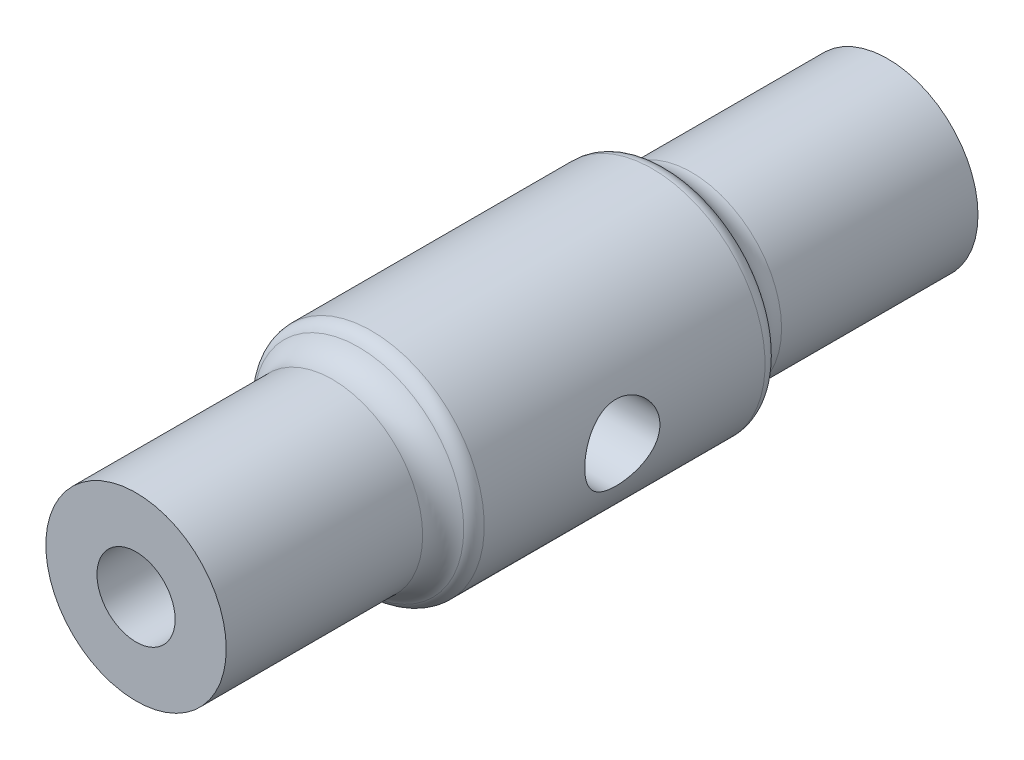
ISO-10303-21;
HEADER;
FILE_DESCRIPTION(('STEP AP214'),'2;1');
FILE_NAME('part.step','',(''),(''),'','','');
FILE_SCHEMA(('AUTOMOTIVE_DESIGN { 1 0 10303 214 1 1 1 1 }'));
ENDSEC;
DATA;
#1=APPLICATION_CONTEXT('core data for automotive mechanical design processes');
#2=APPLICATION_PROTOCOL_DEFINITION('international standard','automotive_design',2000,#1);
#3=PRODUCT_CONTEXT('',#1,'mechanical');
#4=PRODUCT('Part','Part','',(#3));
#5=PRODUCT_RELATED_PRODUCT_CATEGORY('part','',(#4));
#6=PRODUCT_DEFINITION_FORMATION('','',#4);
#7=PRODUCT_DEFINITION_CONTEXT('part definition',#1,'design');
#8=PRODUCT_DEFINITION('design','',#6,#7);
#9=PRODUCT_DEFINITION_SHAPE('','',#8);
#10=(LENGTH_UNIT() NAMED_UNIT(*) SI_UNIT(.MILLI.,.METRE.));
#11=(NAMED_UNIT(*) PLANE_ANGLE_UNIT() SI_UNIT($,.RADIAN.));
#12=(NAMED_UNIT(*) SI_UNIT($,.STERADIAN.) SOLID_ANGLE_UNIT());
#13=UNCERTAINTY_MEASURE_WITH_UNIT(LENGTH_MEASURE(1.E-05),#10,'distance_accuracy_value','');
#14=(GEOMETRIC_REPRESENTATION_CONTEXT(3) GLOBAL_UNCERTAINTY_ASSIGNED_CONTEXT((#13)) GLOBAL_UNIT_ASSIGNED_CONTEXT((#10,
#11,#12)) REPRESENTATION_CONTEXT('',''));
#15=CARTESIAN_POINT('',(0.,0.,0.));
#16=DIRECTION('',(0.,0.,1.));
#17=DIRECTION('',(1.,0.,0.));
#18=AXIS2_PLACEMENT_3D('',#15,#16,#17);
#19=CARTESIAN_POINT('',(-11.,0.,17.6554843869567));
#20=DIRECTION('',(1.,0.,0.));
#21=DIRECTION('',(0.,0.,-1.));
#22=AXIS2_PLACEMENT_3D('',#19,#20,#21);
#23=CYLINDRICAL_SURFACE('',#22,2.5);
#24=CARTESIAN_POINT('',(7.5,0.,15.1554843869567));
#25=CARTESIAN_POINT('',(7.5000003825236,-0.136408407216808,15.1554837526276));
#26=CARTESIAN_POINT('',(7.49624423768862,-0.272812986346375,15.1666850522748));
#27=CARTESIAN_POINT('',(7.48163025508202,-0.541604402182431,15.2110571589998));
#28=CARTESIAN_POINT('',(7.47077168005381,-0.673990820297044,15.244230246829));
#29=CARTESIAN_POINT('',(7.44313269766107,-0.93083197375444,15.3312824954169));
#30=CARTESIAN_POINT('',(7.42636219327133,-1.05529956471509,15.3851270431049));
#31=CARTESIAN_POINT('',(7.38861114293354,-1.29343734201331,15.5118373190526));
#32=CARTESIAN_POINT('',(7.36762976669445,-1.40710539239676,15.5847067994632));
#33=CARTESIAN_POINT('',(7.32285236107513,-1.62435418755567,15.7500488991036));
#34=CARTESIAN_POINT('',(7.29898891159462,-1.72750925074577,15.843062472608));
#35=CARTESIAN_POINT('',(7.25150786957803,-1.91708173175521,16.0449022737232));
#36=CARTESIAN_POINT('',(7.22789033226373,-2.00349546372366,16.153731974278));
#37=CARTESIAN_POINT('',(7.18283331193184,-2.15956235556965,16.3879471749479));
#38=CARTESIAN_POINT('',(7.1614759818922,-2.22866214555258,16.5137187362871));
#39=CARTESIAN_POINT('',(7.12438263546503,-2.3445471846943,16.7759246231031));
#40=CARTESIAN_POINT('',(7.10864490401864,-2.39133924346691,16.9123556798636));
#41=CARTESIAN_POINT('',(7.08528258173443,-2.45968365377291,17.1871674406985));
#42=CARTESIAN_POINT('',(7.07740239424028,-2.48203362067942,17.3253274081794));
#43=CARTESIAN_POINT('',(7.06989141573769,-2.50335280833619,17.6036437723464));
#44=CARTESIAN_POINT('',(7.07025807556825,-2.5023292540118,17.7437995387297));
#45=CARTESIAN_POINT('',(7.0789753752045,-2.47754975925855,18.0153259630668));
#46=CARTESIAN_POINT('',(7.08696039668832,-2.45483478291749,18.1468053942543));
#47=CARTESIAN_POINT('',(7.10941644311377,-2.38901540712354,18.4039679359738));
#48=CARTESIAN_POINT('',(7.12388824460269,-2.34590856647968,18.5296503505444));
#49=CARTESIAN_POINT('',(7.15794777828122,-2.23984764515053,18.7740162609354));
#50=CARTESIAN_POINT('',(7.17761414482793,-2.17658512176816,18.8925544506306));
#51=CARTESIAN_POINT('',(7.21981396439316,-2.03222276575785,19.1176616576561));
#52=CARTESIAN_POINT('',(7.24234824476159,-1.95111778091001,19.2242272042902));
#53=CARTESIAN_POINT('',(7.28918322919352,-1.76837333170559,19.4282133823587));
#54=CARTESIAN_POINT('',(7.31351473387107,-1.66588287519078,19.5248661232294));
#55=CARTESIAN_POINT('',(7.36017345967592,-1.44584892492516,19.6998125536152));
#56=CARTESIAN_POINT('',(7.38250048845168,-1.32830398915204,19.778104482368));
#57=CARTESIAN_POINT('',(7.42292769844484,-1.07986903261567,19.9147251375444));
#58=CARTESIAN_POINT('',(7.44098375020098,-0.948858191040842,19.9728481153086));
#59=CARTESIAN_POINT('',(7.47051417861087,-0.67817270841127,20.065992321846));
#60=CARTESIAN_POINT('',(7.48199084137198,-0.538501095387385,20.1010215755153));
#61=CARTESIAN_POINT('',(7.49669067678601,-0.260959573823261,20.1456235520126));
#62=CARTESIAN_POINT('',(7.5002500458432,-0.123273999662117,20.1562339098886));
#63=CARTESIAN_POINT('',(7.49972256737068,0.151937674900592,20.1546527029606));
#64=CARTESIAN_POINT('',(7.49563701048406,0.289463798299125,20.1424649870071));
#65=CARTESIAN_POINT('',(7.48050061792761,0.556299665760638,20.0964546176168));
#66=CARTESIAN_POINT('',(7.46965496777981,0.685732017087108,20.063268871833));
#67=CARTESIAN_POINT('',(7.44229617075175,0.937139896448933,19.9770007757899));
#68=CARTESIAN_POINT('',(7.42578230116688,1.05911447127152,19.9239158882873));
#69=CARTESIAN_POINT('',(7.38822328218224,1.29572074098318,19.7978083073548));
#70=CARTESIAN_POINT('',(7.36707036889465,1.41007489804287,19.7242979037488));
#71=CARTESIAN_POINT('',(7.32263134790656,1.62516207533897,19.559999011923));
#72=CARTESIAN_POINT('',(7.29934458984569,1.72589091948894,19.4692052468773));
#73=CARTESIAN_POINT('',(7.25192119951112,1.91563126951575,19.2680375094403));
#74=CARTESIAN_POINT('',(7.2277940271857,2.00390242311443,19.1569613196396));
#75=CARTESIAN_POINT('',(7.18249933236772,2.16064380580894,18.9210554674295));
#76=CARTESIAN_POINT('',(7.16133183455006,2.22911386982753,18.7962256903716));
#77=CARTESIAN_POINT('',(7.12455979478459,2.3439923260409,18.536301848732));
#78=CARTESIAN_POINT('',(7.10894401982447,2.39044533041255,18.4012291890348));
#79=CARTESIAN_POINT('',(7.08527080766124,2.45973666689839,18.1245377618464));
#80=CARTESIAN_POINT('',(7.07720996559098,2.48258563738485,17.9829219734459));
#81=CARTESIAN_POINT('',(7.06994647185443,2.50319070619336,17.7049916468545));
#82=CARTESIAN_POINT('',(7.07031000643538,2.502175643271,17.5687785362397));
#83=CARTESIAN_POINT('',(7.07878174559668,2.47810573362173,17.2985716996516));
#84=CARTESIAN_POINT('',(7.08688948923404,2.45505219864646,17.164577842069));
#85=CARTESIAN_POINT('',(7.10961310762229,2.38842953282336,16.9051452294506));
#86=CARTESIAN_POINT('',(7.12410245056194,2.34525836503879,16.7795923244455));
#87=CARTESIAN_POINT('',(7.15790997046171,2.23994841439937,16.5374158696111));
#88=CARTESIAN_POINT('',(7.17722921908483,2.17780542138451,16.4207943089867));
#89=CARTESIAN_POINT('',(7.21957073065115,2.03315173145857,16.1942752121495));
#90=CARTESIAN_POINT('',(7.24271779105343,1.94987060691145,16.0848931322108));
#91=CARTESIAN_POINT('',(7.28958390708132,1.76660720783912,15.8812598534962));
#92=CARTESIAN_POINT('',(7.31330312280931,1.6666202111287,15.7870129477366));
#93=CARTESIAN_POINT('',(7.3597507631386,1.44810389230172,15.6126233562338));
#94=CARTESIAN_POINT('',(7.38240454503142,1.32900378374932,15.5331735175792));
#95=CARTESIAN_POINT('',(7.4231497793153,1.07839339351656,15.3955083148301));
#96=CARTESIAN_POINT('',(7.44124239769824,0.946886295330873,15.3372875221516));
#97=CARTESIAN_POINT('',(7.47013787671354,0.681234118002441,15.2461803057351));
#98=CARTESIAN_POINT('',(7.48123031056307,0.547469394191022,15.2122782212983));
#99=CARTESIAN_POINT('',(7.49616017660555,0.275801040025617,15.1669336852639));
#100=CARTESIAN_POINT('',(7.49999961329762,0.137898563921866,15.1554850282154));
#101=CARTESIAN_POINT('',(7.5,0.,15.1554843869567));
#102=B_SPLINE_CURVE_WITH_KNOTS('',3,(#24,#25,#26,#27,#28,#29,#30,#31,#32,#33,#34,#35,#36,#37,
#38,#39,#40,#41,#42,#43,#44,#45,#46,#47,#48,#49,#50,#51,#52,#53,#54,#55,#56,#57,#58,#59,#60,#61,
#62,#63,#64,#65,#66,#67,#68,#69,#70,#71,#72,#73,#74,#75,#76,#77,#78,#79,#80,#81,#82,#83,#84,#85,
#86,#87,#88,#89,#90,#91,#92,#93,#94,#95,#96,#97,#98,#99,#100,#101),.UNSPECIFIED.,.T.,.F.,(4,2,2,
2,2,2,2,2,2,2,2,2,2,2,2,2,2,2,2,2,2,2,2,2,2,2,2,2,2,2,2,2,2,2,2,2,2,2,4),(0.,0.408717765065027,
0.817477963168802,1.22555668217568,1.63371594449775,2.0546171070689,2.47561083218826,
2.90870962058676,3.34167611732083,3.760048143546,4.17829084968713,4.57742066378201,
4.97659827138705,5.38220427887827,5.78792756395518,6.21483264528417,6.64177864916546,
7.07296014125894,7.50399172193021,7.91633957937924,8.32861782910441,8.72895394945534,
9.1293411321026,9.54025999609341,9.95130452054728,10.3810255720188,10.8107502058749,
11.2396003456693,11.668257117646,12.0748916516065,12.4815019837844,12.8803896770104,
13.2793659543994,13.6957516672951,14.1122552780945,14.5449915208775,14.9776170288114,
15.3909139593453,15.8040966509535),.UNSPECIFIED.);
#103=CARTESIAN_POINT('',(7.5,0.,15.1554843869567));
#104=VERTEX_POINT('',#103);
#105=EDGE_CURVE('E132',#104,#104,#102,.T.);
#106=ORIENTED_EDGE('',*,*,#105,.F.);
#107=EDGE_LOOP('',(#106));
#108=FACE_BOUND('',#107,.T.);
#109=CARTESIAN_POINT('',(2.99999999999999,0.,17.6554843869567));
#110=DIRECTION('',(1.,0.,0.));
#111=DIRECTION('',(0.,0.,-1.));
#112=AXIS2_PLACEMENT_3D('',#109,#110,#111);
#113=CIRCLE('',#112,2.5);
#114=CARTESIAN_POINT('',(2.99999999999999,0.,15.1554843869567));
#115=VERTEX_POINT('',#114);
#116=EDGE_CURVE('E209',#115,#115,#113,.F.);
#117=ORIENTED_EDGE('',*,*,#116,.T.);
#118=EDGE_LOOP('',(#117));
#119=FACE_BOUND('',#118,.T.);
#120=ADVANCED_FACE('F40',(#108,#119),#23,.F.);
#121=CARTESIAN_POINT('',(0.,0.,7.49999999999999));
#122=DIRECTION('',(0.,0.,-1.));
#123=DIRECTION('',(-1.,0.,0.));
#124=AXIS2_PLACEMENT_3D('',#121,#122,#123);
#125=CYLINDRICAL_SURFACE('',#124,6.);
#126=CARTESIAN_POINT('',(0.,0.,5.56350832689628));
#127=DIRECTION('',(0.,0.,1.));
#128=DIRECTION('',(1.,0.,0.));
#129=AXIS2_PLACEMENT_3D('',#126,#127,#128);
#130=CIRCLE('',#129,6.);
#131=CARTESIAN_POINT('',(6.,0.,5.56350832689628));
#132=VERTEX_POINT('',#131);
#133=EDGE_CURVE('E255',#132,#132,#130,.F.);
#134=ORIENTED_EDGE('',*,*,#133,.T.);
#135=EDGE_LOOP('',(#134));
#136=FACE_BOUND('',#135,.T.);
#137=CARTESIAN_POINT('',(0.,0.,-7.49999999999999));
#138=DIRECTION('',(0.,0.,1.));
#139=DIRECTION('',(1.,0.,0.));
#140=AXIS2_PLACEMENT_3D('',#137,#138,#139);
#141=CIRCLE('',#140,6.);
#142=CARTESIAN_POINT('',(6.,0.,-7.49999999999999));
#143=VERTEX_POINT('',#142);
#144=EDGE_CURVE('E146',#143,#143,#141,.T.);
#145=ORIENTED_EDGE('',*,*,#144,.T.);
#146=EDGE_LOOP('',(#145));
#147=FACE_BOUND('',#146,.T.);
#148=ADVANCED_FACE('F198',(#136,#147),#125,.T.);
#149=CARTESIAN_POINT('',(0.,0.,-7.49999999999999));
#150=DIRECTION('',(0.,0.,1.));
#151=DIRECTION('',(1.,0.,0.));
#152=AXIS2_PLACEMENT_3D('',#149,#150,#151);
#153=PLANE('',#152);
#154=CARTESIAN_POINT('',(0.,0.,-7.49999999999999));
#155=DIRECTION('',(0.,0.,-1.));
#156=DIRECTION('',(-1.,0.,0.));
#157=AXIS2_PLACEMENT_3D('',#154,#155,#156);
#158=CIRCLE('',#157,3.1);
#159=CARTESIAN_POINT('',(-3.1,0.,-7.49999999999999));
#160=VERTEX_POINT('',#159);
#161=EDGE_CURVE('E138',#160,#160,#158,.T.);
#162=ORIENTED_EDGE('',*,*,#161,.F.);
#163=EDGE_LOOP('',(#162));
#164=FACE_BOUND('',#163,.T.);
#165=ORIENTED_EDGE('',*,*,#144,.F.);
#166=EDGE_LOOP('',(#165));
#167=FACE_BOUND('',#166,.T.);
#168=ADVANCED_FACE('F193',(#164,#167),#153,.F.);
#169=CARTESIAN_POINT('',(0.,0.,27.5));
#170=DIRECTION('',(0.,0.,-1.));
#171=DIRECTION('',(-1.,0.,0.));
#172=AXIS2_PLACEMENT_3D('',#169,#170,#171);
#173=CYLINDRICAL_SURFACE('',#172,7.5);
#174=CARTESIAN_POINT('',(0.,0.,26.8384154617504));
#175=DIRECTION('',(0.,0.,-1.));
#176=DIRECTION('',(-1.,0.,0.));
#177=AXIS2_PLACEMENT_3D('',#174,#175,#176);
#178=CIRCLE('',#177,7.5);
#179=CARTESIAN_POINT('',(-7.5,0.,26.8384154617504));
#180=VERTEX_POINT('',#179);
#181=EDGE_CURVE('E49',#180,#180,#178,.T.);
#182=ORIENTED_EDGE('',*,*,#181,.T.);
#183=EDGE_LOOP('',(#182));
#184=FACE_BOUND('',#183,.T.);
#185=CARTESIAN_POINT('',(0.,0.,8.1615845382496));
#186=DIRECTION('',(0.,0.,-1.));
#187=DIRECTION('',(-1.,0.,0.));
#188=AXIS2_PLACEMENT_3D('',#185,#186,#187);
#189=CIRCLE('',#188,7.5);
#190=CARTESIAN_POINT('',(-7.5,0.,8.1615845382496));
#191=VERTEX_POINT('',#190);
#192=EDGE_CURVE('E265',#191,#191,#189,.F.);
#193=ORIENTED_EDGE('',*,*,#192,.T.);
#194=EDGE_LOOP('',(#193));
#195=FACE_BOUND('',#194,.T.);
#196=DIRECTION('',(0.,0.,-1.));
#197=VECTOR('',#196,1.);
#198=CARTESIAN_POINT('',(2.99999999999999,-6.87386354243376,27.5));
#199=LINE('',#198,#197);
#200=CARTESIAN_POINT('',(2.99999999999999,-6.87386354243376,23.5));
#201=VERTEX_POINT('',#200);
#202=CARTESIAN_POINT('',(2.99999999999999,-6.87386354243377,11.5));
#203=VERTEX_POINT('',#202);
#204=EDGE_CURVE('E128',#201,#203,#199,.T.);
#205=ORIENTED_EDGE('',*,*,#204,.T.);
#206=CARTESIAN_POINT('',(2.99999999999998,-6.87386354243377,11.5));
#207=CARTESIAN_POINT('',(3.00001197054519,-6.87384696705573,11.4192912212461));
#208=CARTESIAN_POINT('',(2.99674337049035,-6.87528459115985,11.3385915016635));
#209=CARTESIAN_POINT('',(2.98373858960168,-6.88094438126316,11.1778430526179));
#210=CARTESIAN_POINT('',(2.97400487203187,-6.88516548672819,11.0977940869659));
#211=CARTESIAN_POINT('',(2.94821405514552,-6.8962467438096,10.9392297676618));
#212=CARTESIAN_POINT('',(2.93218195230648,-6.903096460763,10.860709623934));
#213=CARTESIAN_POINT('',(2.89397445285989,-6.91920079945024,10.7054488424283));
#214=CARTESIAN_POINT('',(2.87179868125636,-6.92845556798099,10.6287083135841));
#215=CARTESIAN_POINT('',(2.79640457690277,-6.95938936872632,10.4020962241273));
#216=CARTESIAN_POINT('',(2.73426734189982,-6.98426173736141,10.2555186539667));
#217=CARTESIAN_POINT('',(2.5882228738829,-7.03968556148076,9.97480662987474));
#218=CARTESIAN_POINT('',(2.50429494505492,-7.0702424079603,9.84068417055253));
#219=CARTESIAN_POINT('',(2.31197753605169,-7.13551499103152,9.58110640499389));
#220=CARTESIAN_POINT('',(2.20255370988668,-7.17036368453198,9.45644917463968));
#221=CARTESIAN_POINT('',(1.96454469264737,-7.23919185823061,9.22668959166387));
#222=CARTESIAN_POINT('',(1.83595557751111,-7.27317115874872,9.12159125362648));
#223=CARTESIAN_POINT('',(1.55700886211799,-7.33805125658822,8.92989040878438));
#224=CARTESIAN_POINT('',(1.4059918995136,-7.36877736814151,8.84418278640305));
#225=CARTESIAN_POINT('',(1.09023621493285,-7.42205916188651,8.69973389067122));
#226=CARTESIAN_POINT('',(0.925503253773989,-7.44461825320555,8.64098136281726));
#227=CARTESIAN_POINT('',(0.595451161720256,-7.47807471976652,8.55498819908586));
#228=CARTESIAN_POINT('',(0.430546580969978,-7.48948383807038,8.52635957747868));
#229=CARTESIAN_POINT('',(0.0979026464990811,-7.50120465316475,8.49695727624577));
#230=CARTESIAN_POINT('',(-0.0698356818926868,-7.50152028134854,8.49617372867518));
#231=CARTESIAN_POINT('',(-0.39335006720335,-7.4913294001575,8.52172427222666));
#232=CARTESIAN_POINT('',(-0.549268814165814,-7.4814297818847,8.54653761902634));
#233=CARTESIAN_POINT('',(-0.854512169345185,-7.45273905851901,8.61999009156219));
#234=CARTESIAN_POINT('',(-1.00383640384673,-7.43394745021635,8.66863056571331));
#235=CARTESIAN_POINT('',(-1.29434634795235,-7.38895245180781,8.78895462997904));
#236=CARTESIAN_POINT('',(-1.43537542490131,-7.36264159438053,8.86097455766593));
#237=CARTESIAN_POINT('',(-1.70371105589306,-7.3052190570873,9.02569618619784));
#238=CARTESIAN_POINT('',(-1.83101277242677,-7.27410569415328,9.11840514273941));
#239=CARTESIAN_POINT('',(-2.07714567767013,-7.20782663388155,9.32896904281453));
#240=CARTESIAN_POINT('',(-2.19487381816114,-7.1725289948941,9.44807437428684));
#241=CARTESIAN_POINT('',(-2.40914662637397,-7.10342966887715,9.704459475319));
#242=CARTESIAN_POINT('',(-2.50568164332937,-7.06962866894582,9.8417474793345));
#243=CARTESIAN_POINT('',(-2.67741358498184,-7.00643374962441,10.1357464775125));
#244=CARTESIAN_POINT('',(-2.75191695124999,-6.97719454236199,10.2929025324399));
#245=CARTESIAN_POINT('',(-2.84263490078037,-6.9404952078888,10.5371931214669));
#246=CARTESIAN_POINT('',(-2.86936403010708,-6.9294571842925,10.6200279008907));
#247=CARTESIAN_POINT('',(-2.91558286122441,-6.91013780495909,10.7879955053447));
#248=CARTESIAN_POINT('',(-2.93507580880163,-6.90185521344748,10.8731272816319));
#249=CARTESIAN_POINT('',(-2.9671465034321,-6.88813294674513,11.0480858189905));
#250=CARTESIAN_POINT('',(-2.97945146739824,-6.88280576081462,11.1379715123992));
#251=CARTESIAN_POINT('',(-2.99588533788013,-6.87565891169681,11.3185673309109));
#252=CARTESIAN_POINT('',(-3.00001928240829,-6.87383708722422,11.4092769133423));
#253=CARTESIAN_POINT('',(-3.,-6.87386354243376,11.5));
#254=B_SPLINE_CURVE_WITH_KNOTS('',3,(#206,#207,#208,#209,#210,#211,#212,#213,#214,#215,#216,
#217,#218,#219,#220,#221,#222,#223,#224,#225,#226,#227,#228,#229,#230,#231,#232,#233,#234,#235,
#236,#237,#238,#239,#240,#241,#242,#243,#244,#245,#246,#247,#248,#249,#250,#251,#252,#253),
.UNSPECIFIED.,.F.,.F.,(4,2,2,2,2,2,2,2,2,2,2,2,2,2,2,2,2,2,2,2,2,2,2,4),(0.,0.242032279648233,
0.483972395824809,0.724961866877818,0.965966050638455,1.44702450260864,1.92854152413938,
2.43477071993246,2.94110370808785,3.46744288388644,3.99356209795982,4.49420814756403,
4.99467677271981,5.467033728893,5.93941741958479,6.41892265391317,6.89859631699525,
7.4097281201193,7.92109219805104,8.44716362321897,8.71006957989812,8.97285746730815,
9.24506062179347,9.51709589132969),.UNSPECIFIED.);
#255=CARTESIAN_POINT('',(-2.99999999999999,-6.87386354243377,11.5));
#256=VERTEX_POINT('',#255);
#257=EDGE_CURVE('E64',#203,#256,#254,.T.);
#258=ORIENTED_EDGE('',*,*,#257,.T.);
#259=DIRECTION('',(0.,0.,-1.));
#260=VECTOR('',#259,1.);
#261=CARTESIAN_POINT('',(-2.99999999999999,-6.87386354243377,27.5));
#262=LINE('',#261,#260);
#263=CARTESIAN_POINT('',(-2.99999999999999,-6.87386354243377,23.5));
#264=VERTEX_POINT('',#263);
#265=EDGE_CURVE('E88',#256,#264,#262,.F.);
#266=ORIENTED_EDGE('',*,*,#265,.T.);
#267=CARTESIAN_POINT('',(-2.99999999999998,-6.87386354243377,23.5));
#268=CARTESIAN_POINT('',(-3.0000119705452,-6.87384696705573,23.5807087787539));
#269=CARTESIAN_POINT('',(-2.99674337049036,-6.87528459115984,23.6614084983365));
#270=CARTESIAN_POINT('',(-2.98373858960168,-6.88094438126316,23.822156947382));
#271=CARTESIAN_POINT('',(-2.97400487203188,-6.88516548672818,23.902205913034));
#272=CARTESIAN_POINT('',(-2.94821405514553,-6.8962467438096,24.0607702323382));
#273=CARTESIAN_POINT('',(-2.93218195230649,-6.90309646076299,24.139290376066));
#274=CARTESIAN_POINT('',(-2.8939744528599,-6.91920079945024,24.2945511575717));
#275=CARTESIAN_POINT('',(-2.87179868125637,-6.92845556798099,24.3712916864159));
#276=CARTESIAN_POINT('',(-2.79640457690278,-6.95938936872632,24.5979037758727));
#277=CARTESIAN_POINT('',(-2.73426734189983,-6.98426173736141,24.7444813460333));
#278=CARTESIAN_POINT('',(-2.58822287388291,-7.03968556148075,25.0251933701252));
#279=CARTESIAN_POINT('',(-2.50429494505493,-7.0702424079603,25.1593158294474));
#280=CARTESIAN_POINT('',(-2.3119775360517,-7.13551499103151,25.4188935950061));
#281=CARTESIAN_POINT('',(-2.20255370988669,-7.17036368453197,25.5435508253603));
#282=CARTESIAN_POINT('',(-1.96454469264738,-7.23919185823061,25.7733104083361));
#283=CARTESIAN_POINT('',(-1.83595557751112,-7.27317115874871,25.8784087463735));
#284=CARTESIAN_POINT('',(-1.557008862118,-7.33805125658822,26.0701095912156));
#285=CARTESIAN_POINT('',(-1.40599189951361,-7.36877736814151,26.1558172135969));
#286=CARTESIAN_POINT('',(-1.09023621493286,-7.42205916188651,26.3002661093288));
#287=CARTESIAN_POINT('',(-0.925503253773998,-7.44461825320555,26.3590186371827));
#288=CARTESIAN_POINT('',(-0.595451161720264,-7.47807471976652,26.4450118009141));
#289=CARTESIAN_POINT('',(-0.430546580969987,-7.48948383807038,26.4736404225213));
#290=CARTESIAN_POINT('',(-0.0979026464990896,-7.50120465316475,26.5030427237542));
#291=CARTESIAN_POINT('',(0.0698356818926786,-7.50152028134854,26.5038262713248));
#292=CARTESIAN_POINT('',(0.393350067203341,-7.4913294001575,26.4782757277733));
#293=CARTESIAN_POINT('',(0.549268814165805,-7.4814297818847,26.4534623809736));
#294=CARTESIAN_POINT('',(0.854512169345177,-7.45273905851901,26.3800099084378));
#295=CARTESIAN_POINT('',(1.00383640384673,-7.43394745021635,26.3313694342867));
#296=CARTESIAN_POINT('',(1.29434634795234,-7.38895245180782,26.2110453700209));
#297=CARTESIAN_POINT('',(1.4353754249013,-7.36264159438053,26.1390254423341));
#298=CARTESIAN_POINT('',(1.70371105589305,-7.3052190570873,25.9743038138021));
#299=CARTESIAN_POINT('',(1.83101277242676,-7.27410569415329,25.8815948572606));
#300=CARTESIAN_POINT('',(2.07714567767012,-7.20782663388155,25.6710309571854));
#301=CARTESIAN_POINT('',(2.19487381816113,-7.17252899489411,25.5519256257131));
#302=CARTESIAN_POINT('',(2.40914662637396,-7.10342966887715,25.295540524681));
#303=CARTESIAN_POINT('',(2.50568164332936,-7.06962866894583,25.1582525206655));
#304=CARTESIAN_POINT('',(2.67741358498184,-7.00643374962442,24.8642535224875));
#305=CARTESIAN_POINT('',(2.75191695124998,-6.977194542362,24.70709746756));
#306=CARTESIAN_POINT('',(2.84263490078036,-6.9404952078888,24.4628068785331));
#307=CARTESIAN_POINT('',(2.86936403010707,-6.9294571842925,24.3799720991093));
#308=CARTESIAN_POINT('',(2.9155828612244,-6.91013780495909,24.2120044946553));
#309=CARTESIAN_POINT('',(2.93507580880162,-6.90185521344748,24.1268727183681));
#310=CARTESIAN_POINT('',(2.9671465034321,-6.88813294674513,23.9519141810095));
#311=CARTESIAN_POINT('',(2.97945146739823,-6.88280576081462,23.8620284876008));
#312=CARTESIAN_POINT('',(2.99588533788013,-6.87565891169681,23.6814326690891));
#313=CARTESIAN_POINT('',(3.00001928240828,-6.87383708722423,23.5907230866577));
#314=CARTESIAN_POINT('',(2.99999999999999,-6.87386354243376,23.5));
#315=B_SPLINE_CURVE_WITH_KNOTS('',3,(#267,#268,#269,#270,#271,#272,#273,#274,#275,#276,#277,
#278,#279,#280,#281,#282,#283,#284,#285,#286,#287,#288,#289,#290,#291,#292,#293,#294,#295,#296,
#297,#298,#299,#300,#301,#302,#303,#304,#305,#306,#307,#308,#309,#310,#311,#312,#313,#314),
.UNSPECIFIED.,.F.,.F.,(4,2,2,2,2,2,2,2,2,2,2,2,2,2,2,2,2,2,2,2,2,2,2,4),(0.,0.242032279648233,
0.483972395824809,0.724961866877818,0.965966050638453,1.44702450260863,1.92854152413937,
2.43477071993245,2.94110370808785,3.46744288388644,3.99356209795982,4.49420814756402,
4.99467677271981,5.467033728893,5.93941741958479,6.41892265391317,6.89859631699525,
7.4097281201193,7.92109219805103,8.44716362321896,8.71006957989811,8.97285746730814,
9.24506062179347,9.51709589132968),.UNSPECIFIED.);
#316=EDGE_CURVE('E212',#264,#201,#315,.T.);
#317=ORIENTED_EDGE('',*,*,#316,.T.);
#318=EDGE_LOOP('',(#205,#258,#266,#317));
#319=FACE_BOUND('',#318,.T.);
#320=CARTESIAN_POINT('',(-7.5,0.,20.1554843869567));
#321=CARTESIAN_POINT('',(-7.5000003825236,-0.136408407216808,20.1554850212858));
#322=CARTESIAN_POINT('',(-7.49624423768862,-0.272812986346375,20.1442837216387));
#323=CARTESIAN_POINT('',(-7.48163025508202,-0.541604402182431,20.0999116149137));
#324=CARTESIAN_POINT('',(-7.47077168005381,-0.673990820297044,20.0667385270844));
#325=CARTESIAN_POINT('',(-7.44313269766107,-0.930831973754439,19.9796862784966));
#326=CARTESIAN_POINT('',(-7.42636219327133,-1.05529956471508,19.9258417308086));
#327=CARTESIAN_POINT('',(-7.38861114293355,-1.29343734201331,19.7991314548609));
#328=CARTESIAN_POINT('',(-7.36762976669445,-1.40710539239676,19.7262619744502));
#329=CARTESIAN_POINT('',(-7.32285236107513,-1.62435418755567,19.5609198748099));
#330=CARTESIAN_POINT('',(-7.29898891159462,-1.72750925074577,19.4679063013055));
#331=CARTESIAN_POINT('',(-7.25150786957804,-1.91708173175521,19.2660665001903));
#332=CARTESIAN_POINT('',(-7.22789033226373,-2.00349546372366,19.1572367996355));
#333=CARTESIAN_POINT('',(-7.18283331193184,-2.15956235556965,18.9230215989656));
#334=CARTESIAN_POINT('',(-7.1614759818922,-2.22866214555258,18.7972500376264));
#335=CARTESIAN_POINT('',(-7.12438263546503,-2.3445471846943,18.5350441508104));
#336=CARTESIAN_POINT('',(-7.10864490401864,-2.39133924346691,18.3986130940499));
#337=CARTESIAN_POINT('',(-7.08528258173443,-2.45968365377291,18.123801333215));
#338=CARTESIAN_POINT('',(-7.07740239424028,-2.48203362067942,17.9856413657341));
#339=CARTESIAN_POINT('',(-7.06989141573769,-2.50335280833619,17.707325001567));
#340=CARTESIAN_POINT('',(-7.07025807556825,-2.5023292540118,17.5671692351838));
#341=CARTESIAN_POINT('',(-7.0789753752045,-2.47754975925855,17.2956428108467));
#342=CARTESIAN_POINT('',(-7.08696039668832,-2.45483478291749,17.1641633796592));
#343=CARTESIAN_POINT('',(-7.10941644311377,-2.38901540712354,16.9070008379397));
#344=CARTESIAN_POINT('',(-7.12388824460269,-2.34590856647968,16.7813184233691));
#345=CARTESIAN_POINT('',(-7.15794777828122,-2.23984764515053,16.536952512978));
#346=CARTESIAN_POINT('',(-7.17761414482793,-2.17658512176816,16.4184143232829));
#347=CARTESIAN_POINT('',(-7.21981396439316,-2.03222276575785,16.1933071162574));
#348=CARTESIAN_POINT('',(-7.24234824476159,-1.95111778091001,16.0867415696233));
#349=CARTESIAN_POINT('',(-7.28918322919352,-1.76837333170559,15.8827553915548));
#350=CARTESIAN_POINT('',(-7.31351473387107,-1.66588287519078,15.7861026506841));
#351=CARTESIAN_POINT('',(-7.36017345967592,-1.44584892492516,15.6111562202982));
#352=CARTESIAN_POINT('',(-7.38250048845168,-1.32830398915204,15.5328642915455));
#353=CARTESIAN_POINT('',(-7.42292769844484,-1.07986903261567,15.3962436363691));
#354=CARTESIAN_POINT('',(-7.44098375020098,-0.948858191040842,15.3381206586049));
#355=CARTESIAN_POINT('',(-7.47051417861087,-0.67817270841127,15.2449764520675));
#356=CARTESIAN_POINT('',(-7.48199084137198,-0.538501095387386,15.2099471983982));
#357=CARTESIAN_POINT('',(-7.49669067678601,-0.260959573823262,15.1653452219008));
#358=CARTESIAN_POINT('',(-7.5002500458432,-0.123273999662117,15.1547348640249));
#359=CARTESIAN_POINT('',(-7.49972256737068,0.151937674900592,15.1563160709529));
#360=CARTESIAN_POINT('',(-7.49563701048406,0.289463798299125,15.1685037869064));
#361=CARTESIAN_POINT('',(-7.48050061792761,0.556299665760638,15.2145141562966));
#362=CARTESIAN_POINT('',(-7.46965496777981,0.685732017087108,15.2476999020805));
#363=CARTESIAN_POINT('',(-7.44229617075175,0.937139896448933,15.3339679981236));
#364=CARTESIAN_POINT('',(-7.42578230116688,1.05911447127152,15.3870528856262));
#365=CARTESIAN_POINT('',(-7.38822328218224,1.29572074098318,15.5131604665587));
#366=CARTESIAN_POINT('',(-7.36707036889465,1.41007489804287,15.5866708701647));
#367=CARTESIAN_POINT('',(-7.32263134790656,1.62516207533897,15.7509697619905));
#368=CARTESIAN_POINT('',(-7.29934458984569,1.72589091948894,15.8417635270362));
#369=CARTESIAN_POINT('',(-7.25192119951112,1.91563126951575,16.0429312644732));
#370=CARTESIAN_POINT('',(-7.2277940271857,2.00390242311442,16.1540074542739));
#371=CARTESIAN_POINT('',(-7.18249933236772,2.16064380580894,16.389913306484));
#372=CARTESIAN_POINT('',(-7.16133183455006,2.22911386982753,16.5147430835419));
#373=CARTESIAN_POINT('',(-7.12455979478459,2.3439923260409,16.7746669251815));
#374=CARTESIAN_POINT('',(-7.10894401982447,2.39044533041255,16.9097395848787));
#375=CARTESIAN_POINT('',(-7.08527080766124,2.45973666689839,17.1864310120671));
#376=CARTESIAN_POINT('',(-7.07720996559098,2.48258563738485,17.3280468004676));
#377=CARTESIAN_POINT('',(-7.06994647185443,2.50319070619335,17.605977127059));
#378=CARTESIAN_POINT('',(-7.07031000643538,2.502175643271,17.7421902376738));
#379=CARTESIAN_POINT('',(-7.07878174559668,2.47810573362173,18.0123970742619));
#380=CARTESIAN_POINT('',(-7.08688948923404,2.45505219864646,18.1463909318445));
#381=CARTESIAN_POINT('',(-7.10961310762229,2.38842953282336,18.4058235444629));
#382=CARTESIAN_POINT('',(-7.12410245056194,2.34525836503879,18.531376449468));
#383=CARTESIAN_POINT('',(-7.15790997046171,2.23994841439937,18.7735529043024));
#384=CARTESIAN_POINT('',(-7.17722921908483,2.17780542138451,18.8901744649268));
#385=CARTESIAN_POINT('',(-7.21957073065115,2.03315173145857,19.116693561764));
#386=CARTESIAN_POINT('',(-7.24271779105343,1.94987060691145,19.2260756417027));
#387=CARTESIAN_POINT('',(-7.28958390708132,1.76660720783912,19.4297089204172));
#388=CARTESIAN_POINT('',(-7.31330312280931,1.6666202111287,19.5239558261769));
#389=CARTESIAN_POINT('',(-7.3597507631386,1.44810389230172,19.6983454176797));
#390=CARTESIAN_POINT('',(-7.38240454503142,1.32900378374932,19.7777952563342));
#391=CARTESIAN_POINT('',(-7.4231497793153,1.07839339351656,19.9154604590834));
#392=CARTESIAN_POINT('',(-7.44124239769824,0.94688629533087,19.9736812517618));
#393=CARTESIAN_POINT('',(-7.47013787671354,0.681234118002439,20.0647884681784));
#394=CARTESIAN_POINT('',(-7.48123031056307,0.547469394191021,20.0986905526152));
#395=CARTESIAN_POINT('',(-7.49616017660555,0.275801040025617,20.1440350886496));
#396=CARTESIAN_POINT('',(-7.49999961329762,0.137898563921866,20.1554837456981));
#397=CARTESIAN_POINT('',(-7.5,0.,20.1554843869567));
#398=B_SPLINE_CURVE_WITH_KNOTS('',3,(#320,#321,#322,#323,#324,#325,#326,#327,#328,#329,#330,
#331,#332,#333,#334,#335,#336,#337,#338,#339,#340,#341,#342,#343,#344,#345,#346,#347,#348,#349,
#350,#351,#352,#353,#354,#355,#356,#357,#358,#359,#360,#361,#362,#363,#364,#365,#366,#367,#368,
#369,#370,#371,#372,#373,#374,#375,#376,#377,#378,#379,#380,#381,#382,#383,#384,#385,#386,#387,
#388,#389,#390,#391,#392,#393,#394,#395,#396,#397),.UNSPECIFIED.,.T.,.F.,(4,2,2,2,2,2,2,2,2,2,2,
2,2,2,2,2,2,2,2,2,2,2,2,2,2,2,2,2,2,2,2,2,2,2,2,2,2,2,4),(0.,0.408717765065027,
0.817477963168801,1.22555668217568,1.63371594449775,2.0546171070689,2.47561083218826,
2.90870962058676,3.34167611732083,3.760048143546,4.17829084968713,4.57742066378201,
4.97659827138705,5.38220427887827,5.78792756395518,6.21483264528418,6.64177864916546,
7.07296014125894,7.50399172193021,7.91633957937924,8.32861782910441,8.72895394945534,
9.1293411321026,9.54025999609341,9.95130452054728,10.3810255720188,10.8107502058749,
11.2396003456693,11.668257117646,12.0748916516065,12.4815019837844,12.8803896770104,
13.2793659543994,13.6957516672951,14.1122552780945,14.5449915208775,14.9776170288114,
15.3909139593453,15.8040966509535),.UNSPECIFIED.);
#399=CARTESIAN_POINT('',(-7.5,0.,20.1554843869567));
#400=VERTEX_POINT('',#399);
#401=EDGE_CURVE('E142',#400,#400,#398,.T.);
#402=ORIENTED_EDGE('',*,*,#401,.T.);
#403=EDGE_LOOP('',(#402));
#404=FACE_BOUND('',#403,.T.);
#405=ORIENTED_EDGE('',*,*,#105,.T.);
#406=EDGE_LOOP('',(#405));
#407=FACE_BOUND('',#406,.T.);
#408=ADVANCED_FACE('F163',(#184,#195,#319,#404,#407),#173,.T.);
#409=CARTESIAN_POINT('',(0.,0.,27.5));
#410=DIRECTION('',(0.,0.,1.));
#411=DIRECTION('',(1.,0.,0.));
#412=AXIS2_PLACEMENT_3D('',#409,#410,#411);
#413=CYLINDRICAL_SURFACE('',#412,6.);
#414=CARTESIAN_POINT('',(0.,0.,29.4364916731037));
#415=DIRECTION('',(0.,0.,-1.));
#416=DIRECTION('',(-1.,0.,0.));
#417=AXIS2_PLACEMENT_3D('',#414,#415,#416);
#418=CIRCLE('',#417,6.);
#419=CARTESIAN_POINT('',(-6.,0.,29.4364916731037));
#420=VERTEX_POINT('',#419);
#421=EDGE_CURVE('E253',#420,#420,#418,.F.);
#422=ORIENTED_EDGE('',*,*,#421,.T.);
#423=EDGE_LOOP('',(#422));
#424=FACE_BOUND('',#423,.T.);
#425=CARTESIAN_POINT('',(0.,0.,42.5));
#426=DIRECTION('',(0.,0.,1.));
#427=DIRECTION('',(1.,0.,0.));
#428=AXIS2_PLACEMENT_3D('',#425,#426,#427);
#429=CIRCLE('',#428,6.);
#430=CARTESIAN_POINT('',(6.,0.,42.5));
#431=VERTEX_POINT('',#430);
#432=EDGE_CURVE('E137',#431,#431,#429,.T.);
#433=ORIENTED_EDGE('',*,*,#432,.F.);
#434=EDGE_LOOP('',(#433));
#435=FACE_BOUND('',#434,.T.);
#436=ADVANCED_FACE('F186',(#424,#435),#413,.T.);
#437=CARTESIAN_POINT('',(0.,0.,42.5));
#438=DIRECTION('',(0.,0.,-1.));
#439=DIRECTION('',(1.,0.,0.));
#440=AXIS2_PLACEMENT_3D('',#437,#438,#439);
#441=PLANE('',#440);
#442=CARTESIAN_POINT('',(0.,0.,42.5));
#443=DIRECTION('',(0.,0.,1.));
#444=DIRECTION('',(1.,0.,0.));
#445=AXIS2_PLACEMENT_3D('',#442,#443,#444);
#446=CIRCLE('',#445,2.6);
#447=CARTESIAN_POINT('',(2.6,0.,42.5));
#448=VERTEX_POINT('',#447);
#449=EDGE_CURVE('E112',#448,#448,#446,.T.);
#450=ORIENTED_EDGE('',*,*,#449,.F.);
#451=EDGE_LOOP('',(#450));
#452=FACE_BOUND('',#451,.T.);
#453=ORIENTED_EDGE('',*,*,#432,.T.);
#454=EDGE_LOOP('',(#453));
#455=FACE_BOUND('',#454,.T.);
#456=ADVANCED_FACE('F183',(#452,#455),#441,.F.);
#457=CARTESIAN_POINT('',(0.,0.,7.5));
#458=DIRECTION('',(0.,0.,-1.));
#459=DIRECTION('',(-1.,0.,0.));
#460=AXIS2_PLACEMENT_3D('',#457,#458,#459);
#461=CYLINDRICAL_SURFACE('',#460,3.1);
#462=CARTESIAN_POINT('',(0.,0.,7.5));
#463=DIRECTION('',(0.,0.,-1.));
#464=DIRECTION('',(-1.,0.,0.));
#465=AXIS2_PLACEMENT_3D('',#462,#463,#464);
#466=CIRCLE('',#465,3.1);
#467=CARTESIAN_POINT('',(-3.1,0.,7.5));
#468=VERTEX_POINT('',#467);
#469=EDGE_CURVE('E133',#468,#468,#466,.T.);
#470=ORIENTED_EDGE('',*,*,#469,.F.);
#471=EDGE_LOOP('',(#470));
#472=FACE_BOUND('',#471,.T.);
#473=ORIENTED_EDGE('',*,*,#161,.T.);
#474=EDGE_LOOP('',(#473));
#475=FACE_BOUND('',#474,.T.);
#476=ADVANCED_FACE('F179',(#472,#475),#461,.F.);
#477=CARTESIAN_POINT('',(0.,0.,7.5));
#478=DIRECTION('',(0.,0.,-1.));
#479=DIRECTION('',(-1.,0.,0.));
#480=AXIS2_PLACEMENT_3D('',#477,#478,#479);
#481=PLANE('',#480);
#482=ORIENTED_EDGE('',*,*,#469,.T.);
#483=EDGE_LOOP('',(#482));
#484=FACE_BOUND('',#483,.T.);
#485=ADVANCED_FACE('F172',(#484),#481,.T.);
#486=CARTESIAN_POINT('',(-2.99999999999999,0.,17.6554843869567));
#487=DIRECTION('',(-1.,0.,0.));
#488=DIRECTION('',(0.,0.,1.));
#489=AXIS2_PLACEMENT_3D('',#486,#487,#488);
#490=CIRCLE('',#489,2.5);
#491=CARTESIAN_POINT('',(-2.99999999999999,0.,20.1554843869567));
#492=VERTEX_POINT('',#491);
#493=EDGE_CURVE('E150',#492,#492,#490,.F.);
#494=ORIENTED_EDGE('',*,*,#493,.T.);
#495=EDGE_LOOP('',(#494));
#496=FACE_BOUND('',#495,.T.);
#497=ORIENTED_EDGE('',*,*,#401,.F.);
#498=EDGE_LOOP('',(#497));
#499=FACE_BOUND('',#498,.T.);
#500=ADVANCED_FACE('F167',(#496,#499),#23,.F.);
#501=CARTESIAN_POINT('',(0.,-20.,11.5));
#502=DIRECTION('',(0.,1.,0.));
#503=DIRECTION('',(0.,0.,1.));
#504=AXIS2_PLACEMENT_3D('',#501,#502,#503);
#505=CYLINDRICAL_SURFACE('',#504,2.99999999999999);
#506=DIRECTION('',(0.,1.,0.));
#507=VECTOR('',#506,1.);
#508=CARTESIAN_POINT('',(2.99999999999999,-20.,11.5));
#509=LINE('',#508,#507);
#510=CARTESIAN_POINT('',(2.99999999999998,6.,11.5));
#511=VERTEX_POINT('',#510);
#512=EDGE_CURVE('E95',#203,#511,#509,.T.);
#513=ORIENTED_EDGE('',*,*,#512,.T.);
#514=CARTESIAN_POINT('',(0.,6.,11.5));
#515=DIRECTION('',(0.,-1.,0.));
#516=DIRECTION('',(0.,0.,-1.));
#517=AXIS2_PLACEMENT_3D('',#514,#515,#516);
#518=CIRCLE('',#517,2.99999999999998);
#519=CARTESIAN_POINT('',(-2.99999999999999,6.,11.5));
#520=VERTEX_POINT('',#519);
#521=EDGE_CURVE('E93',#520,#511,#518,.T.);
#522=ORIENTED_EDGE('',*,*,#521,.F.);
#523=DIRECTION('',(0.,1.,0.));
#524=VECTOR('',#523,1.);
#525=CARTESIAN_POINT('',(-2.99999999999999,-20.,11.5));
#526=LINE('',#525,#524);
#527=EDGE_CURVE('E80',#256,#520,#526,.T.);
#528=ORIENTED_EDGE('',*,*,#527,.F.);
#529=ORIENTED_EDGE('',*,*,#257,.F.);
#530=EDGE_LOOP('',(#513,#522,#528,#529));
#531=FACE_BOUND('',#530,.T.);
#532=ADVANCED_FACE('F94',(#531),#505,.F.);
#533=CARTESIAN_POINT('',(0.,-20.,23.5));
#534=DIRECTION('',(0.,1.,0.));
#535=DIRECTION('',(0.,0.,1.));
#536=AXIS2_PLACEMENT_3D('',#533,#534,#535);
#537=CYLINDRICAL_SURFACE('',#536,2.99999999999999);
#538=DIRECTION('',(0.,1.,0.));
#539=VECTOR('',#538,1.);
#540=CARTESIAN_POINT('',(-2.99999999999998,-20.,23.5));
#541=LINE('',#540,#539);
#542=CARTESIAN_POINT('',(-2.99999999999999,6.,23.5));
#543=VERTEX_POINT('',#542);
#544=EDGE_CURVE('E56',#264,#543,#541,.T.);
#545=ORIENTED_EDGE('',*,*,#544,.T.);
#546=CARTESIAN_POINT('',(0.,6.,23.5));
#547=DIRECTION('',(0.,-1.,0.));
#548=DIRECTION('',(0.,0.,-1.));
#549=AXIS2_PLACEMENT_3D('',#546,#547,#548);
#550=CIRCLE('',#549,2.99999999999999);
#551=CARTESIAN_POINT('',(2.99999999999999,6.,23.5));
#552=VERTEX_POINT('',#551);
#553=EDGE_CURVE('E104',#552,#543,#550,.T.);
#554=ORIENTED_EDGE('',*,*,#553,.F.);
#555=DIRECTION('',(0.,1.,0.));
#556=VECTOR('',#555,1.);
#557=CARTESIAN_POINT('',(2.99999999999999,-20.,23.5));
#558=LINE('',#557,#556);
#559=EDGE_CURVE('E121',#201,#552,#558,.T.);
#560=ORIENTED_EDGE('',*,*,#559,.F.);
#561=ORIENTED_EDGE('',*,*,#316,.F.);
#562=EDGE_LOOP('',(#545,#554,#560,#561));
#563=FACE_BOUND('',#562,.T.);
#564=ADVANCED_FACE('F230',(#563),#537,.F.);
#565=CARTESIAN_POINT('',(2.99999999999999,-20.,11.5));
#566=DIRECTION('',(1.,0.,0.));
#567=DIRECTION('',(0.,0.,-1.));
#568=AXIS2_PLACEMENT_3D('',#565,#566,#567);
#569=PLANE('',#568);
#570=ORIENTED_EDGE('',*,*,#116,.F.);
#571=EDGE_LOOP('',(#570));
#572=FACE_BOUND('',#571,.T.);
#573=ORIENTED_EDGE('',*,*,#559,.T.);
#574=DIRECTION('',(0.,0.,-1.));
#575=VECTOR('',#574,1.);
#576=CARTESIAN_POINT('',(2.99999999999993,6.,0.));
#577=LINE('',#576,#575);
#578=EDGE_CURVE('E100',#552,#511,#577,.T.);
#579=ORIENTED_EDGE('',*,*,#578,.T.);
#580=ORIENTED_EDGE('',*,*,#512,.F.);
#581=ORIENTED_EDGE('',*,*,#204,.F.);
#582=EDGE_LOOP('',(#573,#579,#580,#581));
#583=FACE_BOUND('',#582,.T.);
#584=ADVANCED_FACE('F234',(#572,#583),#569,.F.);
#585=CARTESIAN_POINT('',(-2.99999999999999,-20.,11.5));
#586=DIRECTION('',(-1.,0.,0.));
#587=DIRECTION('',(0.,0.,1.));
#588=AXIS2_PLACEMENT_3D('',#585,#586,#587);
#589=PLANE('',#588);
#590=DIRECTION('',(0.,0.,-1.));
#591=VECTOR('',#590,1.);
#592=CARTESIAN_POINT('',(-2.99999999999999,6.,0.));
#593=LINE('',#592,#591);
#594=EDGE_CURVE('E85',#543,#520,#593,.T.);
#595=ORIENTED_EDGE('',*,*,#594,.F.);
#596=ORIENTED_EDGE('',*,*,#544,.F.);
#597=ORIENTED_EDGE('',*,*,#265,.F.);
#598=ORIENTED_EDGE('',*,*,#527,.T.);
#599=EDGE_LOOP('',(#595,#596,#597,#598));
#600=FACE_BOUND('',#599,.T.);
#601=ORIENTED_EDGE('',*,*,#493,.F.);
#602=EDGE_LOOP('',(#601));
#603=FACE_BOUND('',#602,.T.);
#604=ADVANCED_FACE('F82',(#600,#603),#589,.F.);
#605=CARTESIAN_POINT('',(0.,0.,29.4364916731037));
#606=DIRECTION('',(0.,0.,-1.));
#607=DIRECTION('',(-1.,0.,0.));
#608=AXIS2_PLACEMENT_3D('',#605,#606,#607);
#609=TOROIDAL_SURFACE('',#608,8.,2.);
#610=CARTESIAN_POINT('',(0.,0.,27.7044408655348));
#611=DIRECTION('',(0.,0.,1.));
#612=DIRECTION('',(1.,0.,0.));
#613=AXIS2_PLACEMENT_3D('',#610,#611,#612);
#614=CIRCLE('',#613,7.);
#615=CARTESIAN_POINT('',(7.,0.,27.7044408655348));
#616=VERTEX_POINT('',#615);
#617=EDGE_CURVE('E259',#616,#616,#614,.T.);
#618=ORIENTED_EDGE('',*,*,#617,.T.);
#619=EDGE_LOOP('',(#618));
#620=FACE_BOUND('',#619,.T.);
#621=ORIENTED_EDGE('',*,*,#421,.F.);
#622=EDGE_LOOP('',(#621));
#623=FACE_BOUND('',#622,.T.);
#624=ADVANCED_FACE('F238',(#620,#623),#609,.F.);
#625=CARTESIAN_POINT('',(0.,0.,5.56350832689628));
#626=DIRECTION('',(0.,0.,1.));
#627=DIRECTION('',(1.,0.,0.));
#628=AXIS2_PLACEMENT_3D('',#625,#626,#627);
#629=TOROIDAL_SURFACE('',#628,8.,2.);
#630=CARTESIAN_POINT('',(0.,0.,7.29555913446515));
#631=DIRECTION('',(0.,0.,-1.));
#632=DIRECTION('',(-1.,0.,0.));
#633=AXIS2_PLACEMENT_3D('',#630,#631,#632);
#634=CIRCLE('',#633,7.00000000000001);
#635=CARTESIAN_POINT('',(-7.00000000000001,0.,7.29555913446515));
#636=VERTEX_POINT('',#635);
#637=EDGE_CURVE('E12',#636,#636,#634,.T.);
#638=ORIENTED_EDGE('',*,*,#637,.T.);
#639=EDGE_LOOP('',(#638));
#640=FACE_BOUND('',#639,.T.);
#641=ORIENTED_EDGE('',*,*,#133,.F.);
#642=EDGE_LOOP('',(#641));
#643=FACE_BOUND('',#642,.T.);
#644=ADVANCED_FACE('F243',(#640,#643),#629,.F.);
#645=CARTESIAN_POINT('',(0.,0.,26.8384154617504));
#646=DIRECTION('',(0.,0.,-1.));
#647=DIRECTION('',(-1.,0.,0.));
#648=AXIS2_PLACEMENT_3D('',#645,#646,#647);
#649=TOROIDAL_SURFACE('',#648,6.5,1.);
#650=ORIENTED_EDGE('',*,*,#181,.F.);
#651=EDGE_LOOP('',(#650));
#652=FACE_BOUND('',#651,.T.);
#653=ORIENTED_EDGE('',*,*,#617,.F.);
#654=EDGE_LOOP('',(#653));
#655=FACE_BOUND('',#654,.T.);
#656=ADVANCED_FACE('F273',(#652,#655),#649,.T.);
#657=CARTESIAN_POINT('',(0.,0.,8.1615845382496));
#658=DIRECTION('',(0.,0.,-1.));
#659=DIRECTION('',(-1.,0.,0.));
#660=AXIS2_PLACEMENT_3D('',#657,#658,#659);
#661=TOROIDAL_SURFACE('',#660,6.5,1.);
#662=ORIENTED_EDGE('',*,*,#637,.F.);
#663=EDGE_LOOP('',(#662));
#664=FACE_BOUND('',#663,.T.);
#665=ORIENTED_EDGE('',*,*,#192,.F.);
#666=EDGE_LOOP('',(#665));
#667=FACE_BOUND('',#666,.T.);
#668=ADVANCED_FACE('F42',(#664,#667),#661,.T.);
#669=CARTESIAN_POINT('',(0.,0.,27.5));
#670=DIRECTION('',(0.,0.,1.));
#671=DIRECTION('',(1.,0.,0.));
#672=AXIS2_PLACEMENT_3D('',#669,#670,#671);
#673=CYLINDRICAL_SURFACE('',#672,2.6);
#674=CARTESIAN_POINT('',(0.,0.,27.5));
#675=DIRECTION('',(0.,0.,1.));
#676=DIRECTION('',(1.,0.,0.));
#677=AXIS2_PLACEMENT_3D('',#674,#675,#676);
#678=CIRCLE('',#677,2.6);
#679=CARTESIAN_POINT('',(2.6,0.,27.5));
#680=VERTEX_POINT('',#679);
#681=EDGE_CURVE('E90',#680,#680,#678,.T.);
#682=ORIENTED_EDGE('',*,*,#681,.F.);
#683=EDGE_LOOP('',(#682));
#684=FACE_BOUND('',#683,.T.);
#685=ORIENTED_EDGE('',*,*,#449,.T.);
#686=EDGE_LOOP('',(#685));
#687=FACE_BOUND('',#686,.T.);
#688=ADVANCED_FACE('F282',(#684,#687),#673,.F.);
#689=CARTESIAN_POINT('',(0.,0.,27.5));
#690=DIRECTION('',(0.,0.,1.));
#691=DIRECTION('',(1.,0.,0.));
#692=AXIS2_PLACEMENT_3D('',#689,#690,#691);
#693=PLANE('',#692);
#694=ORIENTED_EDGE('',*,*,#681,.T.);
#695=EDGE_LOOP('',(#694));
#696=FACE_BOUND('',#695,.T.);
#697=ADVANCED_FACE('F343',(#696),#693,.T.);
#698=CARTESIAN_POINT('',(0.,6.,0.));
#699=DIRECTION('',(0.,-1.,0.));
#700=DIRECTION('',(0.,0.,-1.));
#701=AXIS2_PLACEMENT_3D('',#698,#699,#700);
#702=PLANE('',#701);
#703=ORIENTED_EDGE('',*,*,#594,.T.);
#704=ORIENTED_EDGE('',*,*,#521,.T.);
#705=ORIENTED_EDGE('',*,*,#578,.F.);
#706=ORIENTED_EDGE('',*,*,#553,.T.);
#707=EDGE_LOOP('',(#703,#704,#705,#706));
#708=FACE_BOUND('',#707,.T.);
#709=ADVANCED_FACE('F102',(#708),#702,.T.);
#710=CLOSED_SHELL('',(#120,#148,#168,#408,#436,#456,#476,#485,#500,#532,#564,#584,#604,#624,
#644,#656,#668,#688,#697,#709));
#711=MANIFOLD_SOLID_BREP('B2',#710);
#712=ADVANCED_BREP_SHAPE_REPRESENTATION('',(#18,#711),#14);
#713=SHAPE_DEFINITION_REPRESENTATION(#9,#712);
ENDSEC;
END-ISO-10303-21;
